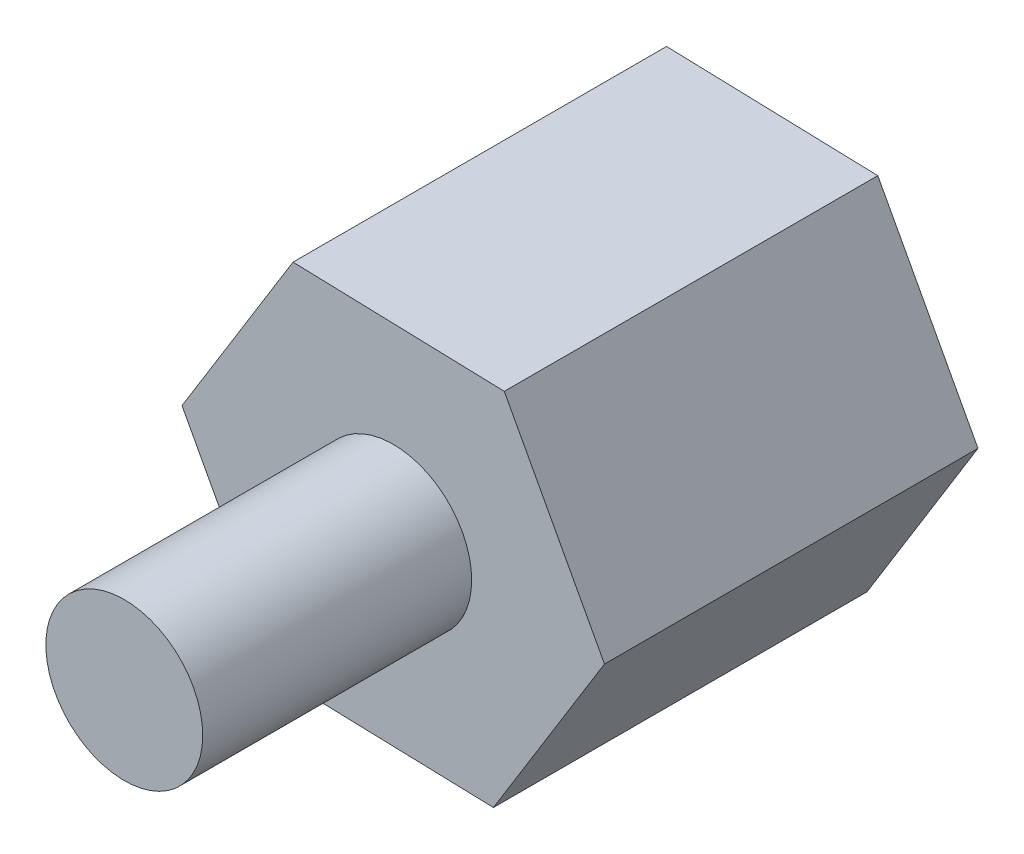
ISO-10303-21;
HEADER;
FILE_DESCRIPTION(('STEP AP214'),'2;1');
FILE_NAME('part.step','',(''),(''),'','','');
FILE_SCHEMA(('AUTOMOTIVE_DESIGN { 1 0 10303 214 1 1 1 1 }'));
ENDSEC;
DATA;
#1=APPLICATION_CONTEXT('core data for automotive mechanical design processes');
#2=APPLICATION_PROTOCOL_DEFINITION('international standard','automotive_design',2000,#1);
#3=PRODUCT_CONTEXT('',#1,'mechanical');
#4=PRODUCT('Part','Part','',(#3));
#5=PRODUCT_RELATED_PRODUCT_CATEGORY('part','',(#4));
#6=PRODUCT_DEFINITION_FORMATION('','',#4);
#7=PRODUCT_DEFINITION_CONTEXT('part definition',#1,'design');
#8=PRODUCT_DEFINITION('design','',#6,#7);
#9=PRODUCT_DEFINITION_SHAPE('','',#8);
#10=(LENGTH_UNIT() NAMED_UNIT(*) SI_UNIT(.MILLI.,.METRE.));
#11=(NAMED_UNIT(*) PLANE_ANGLE_UNIT() SI_UNIT($,.RADIAN.));
#12=(NAMED_UNIT(*) SI_UNIT($,.STERADIAN.) SOLID_ANGLE_UNIT());
#13=UNCERTAINTY_MEASURE_WITH_UNIT(LENGTH_MEASURE(1.E-05),#10,'distance_accuracy_value','');
#14=(GEOMETRIC_REPRESENTATION_CONTEXT(3) GLOBAL_UNCERTAINTY_ASSIGNED_CONTEXT((#13)) GLOBAL_UNIT_ASSIGNED_CONTEXT((#10,
#11,#12)) REPRESENTATION_CONTEXT('',''));
#15=CARTESIAN_POINT('',(0.,0.,0.));
#16=DIRECTION('',(0.,0.,1.));
#17=DIRECTION('',(1.,0.,0.));
#18=AXIS2_PLACEMENT_3D('',#15,#16,#17);
#19=CARTESIAN_POINT('',(1.88801747757183,3.05679020178301,6.35));
#20=DIRECTION('',(0.,0.,1.));
#21=DIRECTION('',(1.,0.,0.));
#22=AXIS2_PLACEMENT_3D('',#19,#20,#21);
#23=PLANE('',#22);
#24=DIRECTION('',(-0.474066238841119,0.880489182892689,0.));
#25=VECTOR('',#24,1.);
#26=CARTESIAN_POINT('',(3.59126670756936,-0.106675997474725,6.35));
#27=LINE('',#26,#25);
#28=CARTESIAN_POINT('',(3.59126670756936,-0.106675997474725,6.35));
#29=VERTEX_POINT('',#28);
#30=CARTESIAN_POINT('',(1.88801747757183,3.05679020178301,6.35));
#31=VERTEX_POINT('',#30);
#32=EDGE_CURVE('E148',#29,#31,#27,.T.);
#33=ORIENTED_EDGE('',*,*,#32,.T.);
#34=DIRECTION('',(-0.999559119563031,0.0296911855333934,0.));
#35=VECTOR('',#34,1.);
#36=CARTESIAN_POINT('',(1.88801747757183,3.05679020178301,6.35));
#37=LINE('',#36,#35);
#38=CARTESIAN_POINT('',(-1.70324922999752,3.16346619925773,6.35));
#39=VERTEX_POINT('',#38);
#40=EDGE_CURVE('E99',#31,#39,#37,.T.);
#41=ORIENTED_EDGE('',*,*,#40,.T.);
#42=DIRECTION('',(-0.525492880721911,-0.850797997359295,0.));
#43=VECTOR('',#42,1.);
#44=CARTESIAN_POINT('',(-1.70324922999752,3.16346619925773,6.35));
#45=LINE('',#44,#43);
#46=CARTESIAN_POINT('',(-3.59126670756936,0.106675997474717,6.35));
#47=VERTEX_POINT('',#46);
#48=EDGE_CURVE('E113',#39,#47,#45,.T.);
#49=ORIENTED_EDGE('',*,*,#48,.T.);
#50=DIRECTION('',(0.474066238841119,-0.880489182892689,0.));
#51=VECTOR('',#50,1.);
#52=CARTESIAN_POINT('',(-3.59126670756936,0.106675997474717,6.35));
#53=LINE('',#52,#51);
#54=CARTESIAN_POINT('',(-1.88801747757183,-3.05679020178301,6.35));
#55=VERTEX_POINT('',#54);
#56=EDGE_CURVE('E107',#47,#55,#53,.T.);
#57=ORIENTED_EDGE('',*,*,#56,.T.);
#58=DIRECTION('',(0.999559119563031,-0.0296911855333934,0.));
#59=VECTOR('',#58,1.);
#60=CARTESIAN_POINT('',(-1.88801747757183,-3.05679020178301,6.35));
#61=LINE('',#60,#59);
#62=CARTESIAN_POINT('',(1.70324922999752,-3.16346619925774,6.35));
#63=VERTEX_POINT('',#62);
#64=EDGE_CURVE('E111',#55,#63,#61,.T.);
#65=ORIENTED_EDGE('',*,*,#64,.T.);
#66=DIRECTION('',(0.525492880721912,0.850797997359295,0.));
#67=VECTOR('',#66,1.);
#68=CARTESIAN_POINT('',(1.70324922999752,-3.16346619925774,6.35));
#69=LINE('',#68,#67);
#70=EDGE_CURVE('E57',#63,#29,#69,.T.);
#71=ORIENTED_EDGE('',*,*,#70,.T.);
#72=EDGE_LOOP('',(#33,#41,#49,#57,#65,#71));
#73=FACE_BOUND('',#72,.T.);
#74=CARTESIAN_POINT('',(0.,0.,6.35));
#75=DIRECTION('',(0.,0.,1.));
#76=DIRECTION('',(1.,0.,0.));
#77=AXIS2_PLACEMENT_3D('',#74,#75,#76);
#78=CIRCLE('',#77,1.3335);
#79=CARTESIAN_POINT('',(1.3335,0.,6.35));
#80=VERTEX_POINT('',#79);
#81=EDGE_CURVE('E204',#80,#80,#78,.T.);
#82=ORIENTED_EDGE('',*,*,#81,.F.);
#83=EDGE_LOOP('',(#82));
#84=FACE_BOUND('',#83,.T.);
#85=ADVANCED_FACE('F38',(#73,#84),#23,.T.);
#86=CARTESIAN_POINT('',(3.59126670756936,-0.106675997474725,6.35));
#87=DIRECTION('',(-0.880489182892689,-0.474066238841119,0.));
#88=DIRECTION('',(0.474066238841119,-0.880489182892689,0.));
#89=AXIS2_PLACEMENT_3D('',#86,#87,#88);
#90=PLANE('',#89);
#91=DIRECTION('',(-0.474066238841119,0.880489182892689,0.));
#92=VECTOR('',#91,1.);
#93=CARTESIAN_POINT('',(3.59126670756936,-0.106675997474725,0.));
#94=LINE('',#93,#92);
#95=CARTESIAN_POINT('',(3.59126670756936,-0.106675997474725,0.));
#96=VERTEX_POINT('',#95);
#97=CARTESIAN_POINT('',(1.88801747757183,3.05679020178301,0.));
#98=VERTEX_POINT('',#97);
#99=EDGE_CURVE('E135',#96,#98,#94,.T.);
#100=ORIENTED_EDGE('',*,*,#99,.T.);
#101=DIRECTION('',(0.,0.,-1.));
#102=VECTOR('',#101,1.);
#103=CARTESIAN_POINT('',(1.88801747757183,3.05679020178301,6.35));
#104=LINE('',#103,#102);
#105=EDGE_CURVE('E11',#31,#98,#104,.T.);
#106=ORIENTED_EDGE('',*,*,#105,.F.);
#107=ORIENTED_EDGE('',*,*,#32,.F.);
#108=DIRECTION('',(0.,0.,-1.));
#109=VECTOR('',#108,1.);
#110=CARTESIAN_POINT('',(3.59126670756936,-0.106675997474725,6.35));
#111=LINE('',#110,#109);
#112=EDGE_CURVE('E131',#29,#96,#111,.T.);
#113=ORIENTED_EDGE('',*,*,#112,.T.);
#114=EDGE_LOOP('',(#100,#106,#107,#113));
#115=FACE_BOUND('',#114,.T.);
#116=ADVANCED_FACE('F40',(#115),#90,.F.);
#117=CARTESIAN_POINT('',(1.88801747757183,3.05679020178301,6.35));
#118=DIRECTION('',(-0.0296911855333934,-0.999559119563031,0.));
#119=DIRECTION('',(0.999559119563031,-0.0296911855333934,0.));
#120=AXIS2_PLACEMENT_3D('',#117,#118,#119);
#121=PLANE('',#120);
#122=DIRECTION('',(-0.999559119563031,0.0296911855333934,0.));
#123=VECTOR('',#122,1.);
#124=CARTESIAN_POINT('',(1.88801747757183,3.05679020178301,0.));
#125=LINE('',#124,#123);
#126=CARTESIAN_POINT('',(-1.70324922999752,3.16346619925773,0.));
#127=VERTEX_POINT('',#126);
#128=EDGE_CURVE('E138',#98,#127,#125,.T.);
#129=ORIENTED_EDGE('',*,*,#128,.T.);
#130=DIRECTION('',(0.,0.,-1.));
#131=VECTOR('',#130,1.);
#132=CARTESIAN_POINT('',(-1.70324922999752,3.16346619925773,6.35));
#133=LINE('',#132,#131);
#134=EDGE_CURVE('E47',#39,#127,#133,.T.);
#135=ORIENTED_EDGE('',*,*,#134,.F.);
#136=ORIENTED_EDGE('',*,*,#40,.F.);
#137=ORIENTED_EDGE('',*,*,#105,.T.);
#138=EDGE_LOOP('',(#129,#135,#136,#137));
#139=FACE_BOUND('',#138,.T.);
#140=ADVANCED_FACE('F183',(#139),#121,.F.);
#141=CARTESIAN_POINT('',(-1.70324922999752,3.16346619925773,6.35));
#142=DIRECTION('',(0.850797997359295,-0.525492880721911,0.));
#143=DIRECTION('',(0.525492880721911,0.850797997359295,0.));
#144=AXIS2_PLACEMENT_3D('',#141,#142,#143);
#145=PLANE('',#144);
#146=DIRECTION('',(-0.525492880721911,-0.850797997359295,0.));
#147=VECTOR('',#146,1.);
#148=CARTESIAN_POINT('',(-1.70324922999752,3.16346619925773,0.));
#149=LINE('',#148,#147);
#150=CARTESIAN_POINT('',(-3.59126670756936,0.106675997474717,0.));
#151=VERTEX_POINT('',#150);
#152=EDGE_CURVE('E141',#127,#151,#149,.T.);
#153=ORIENTED_EDGE('',*,*,#152,.T.);
#154=DIRECTION('',(0.,0.,-1.));
#155=VECTOR('',#154,1.);
#156=CARTESIAN_POINT('',(-3.59126670756936,0.106675997474717,6.35));
#157=LINE('',#156,#155);
#158=EDGE_CURVE('E124',#47,#151,#157,.T.);
#159=ORIENTED_EDGE('',*,*,#158,.F.);
#160=ORIENTED_EDGE('',*,*,#48,.F.);
#161=ORIENTED_EDGE('',*,*,#134,.T.);
#162=EDGE_LOOP('',(#153,#159,#160,#161));
#163=FACE_BOUND('',#162,.T.);
#164=ADVANCED_FACE('F160',(#163),#145,.F.);
#165=CARTESIAN_POINT('',(-3.59126670756936,0.106675997474717,6.35));
#166=DIRECTION('',(0.880489182892689,0.474066238841119,0.));
#167=DIRECTION('',(-0.474066238841119,0.880489182892689,0.));
#168=AXIS2_PLACEMENT_3D('',#165,#166,#167);
#169=PLANE('',#168);
#170=DIRECTION('',(0.474066238841119,-0.880489182892689,0.));
#171=VECTOR('',#170,1.);
#172=CARTESIAN_POINT('',(-3.59126670756936,0.106675997474717,0.));
#173=LINE('',#172,#171);
#174=CARTESIAN_POINT('',(-1.88801747757183,-3.05679020178301,0.));
#175=VERTEX_POINT('',#174);
#176=EDGE_CURVE('E122',#151,#175,#173,.T.);
#177=ORIENTED_EDGE('',*,*,#176,.T.);
#178=DIRECTION('',(0.,0.,-1.));
#179=VECTOR('',#178,1.);
#180=CARTESIAN_POINT('',(-1.88801747757183,-3.05679020178301,6.35));
#181=LINE('',#180,#179);
#182=EDGE_CURVE('E119',#55,#175,#181,.T.);
#183=ORIENTED_EDGE('',*,*,#182,.F.);
#184=ORIENTED_EDGE('',*,*,#56,.F.);
#185=ORIENTED_EDGE('',*,*,#158,.T.);
#186=EDGE_LOOP('',(#177,#183,#184,#185));
#187=FACE_BOUND('',#186,.T.);
#188=ADVANCED_FACE('F120',(#187),#169,.F.);
#189=CARTESIAN_POINT('',(-1.88801747757183,-3.05679020178301,6.35));
#190=DIRECTION('',(0.0296911855333934,0.999559119563031,0.));
#191=DIRECTION('',(-0.999559119563031,0.0296911855333934,0.));
#192=AXIS2_PLACEMENT_3D('',#189,#190,#191);
#193=PLANE('',#192);
#194=DIRECTION('',(0.999559119563031,-0.0296911855333934,0.));
#195=VECTOR('',#194,1.);
#196=CARTESIAN_POINT('',(-1.88801747757183,-3.05679020178301,0.));
#197=LINE('',#196,#195);
#198=CARTESIAN_POINT('',(1.70324922999752,-3.16346619925774,0.));
#199=VERTEX_POINT('',#198);
#200=EDGE_CURVE('E85',#175,#199,#197,.T.);
#201=ORIENTED_EDGE('',*,*,#200,.T.);
#202=DIRECTION('',(0.,0.,-1.));
#203=VECTOR('',#202,1.);
#204=CARTESIAN_POINT('',(1.70324922999752,-3.16346619925774,6.35));
#205=LINE('',#204,#203);
#206=EDGE_CURVE('E125',#63,#199,#205,.T.);
#207=ORIENTED_EDGE('',*,*,#206,.F.);
#208=ORIENTED_EDGE('',*,*,#64,.F.);
#209=ORIENTED_EDGE('',*,*,#182,.T.);
#210=EDGE_LOOP('',(#201,#207,#208,#209));
#211=FACE_BOUND('',#210,.T.);
#212=ADVANCED_FACE('F127',(#211),#193,.F.);
#213=CARTESIAN_POINT('',(1.70324922999752,-3.16346619925774,6.35));
#214=DIRECTION('',(-0.850797997359295,0.525492880721912,0.));
#215=DIRECTION('',(-0.525492880721912,-0.850797997359295,0.));
#216=AXIS2_PLACEMENT_3D('',#213,#214,#215);
#217=PLANE('',#216);
#218=DIRECTION('',(0.525492880721912,0.850797997359295,0.));
#219=VECTOR('',#218,1.);
#220=CARTESIAN_POINT('',(1.70324922999752,-3.16346619925774,0.));
#221=LINE('',#220,#219);
#222=EDGE_CURVE('E91',#199,#96,#221,.T.);
#223=ORIENTED_EDGE('',*,*,#222,.T.);
#224=ORIENTED_EDGE('',*,*,#112,.F.);
#225=ORIENTED_EDGE('',*,*,#70,.F.);
#226=ORIENTED_EDGE('',*,*,#206,.T.);
#227=EDGE_LOOP('',(#223,#224,#225,#226));
#228=FACE_BOUND('',#227,.T.);
#229=ADVANCED_FACE('F167',(#228),#217,.F.);
#230=CARTESIAN_POINT('',(1.88801747757183,3.05679020178301,0.));
#231=DIRECTION('',(0.,0.,1.));
#232=DIRECTION('',(1.,0.,0.));
#233=AXIS2_PLACEMENT_3D('',#230,#231,#232);
#234=PLANE('',#233);
#235=CARTESIAN_POINT('',(0.,0.,0.));
#236=DIRECTION('',(0.,0.,-1.));
#237=DIRECTION('',(-1.,0.,0.));
#238=AXIS2_PLACEMENT_3D('',#235,#236,#237);
#239=CIRCLE('',#238,1.3335);
#240=CARTESIAN_POINT('',(-1.3335,0.,0.));
#241=VERTEX_POINT('',#240);
#242=EDGE_CURVE('E205',#241,#241,#239,.T.);
#243=ORIENTED_EDGE('',*,*,#242,.F.);
#244=EDGE_LOOP('',(#243));
#245=FACE_BOUND('',#244,.T.);
#246=ORIENTED_EDGE('',*,*,#99,.F.);
#247=ORIENTED_EDGE('',*,*,#222,.F.);
#248=ORIENTED_EDGE('',*,*,#200,.F.);
#249=ORIENTED_EDGE('',*,*,#176,.F.);
#250=ORIENTED_EDGE('',*,*,#152,.F.);
#251=ORIENTED_EDGE('',*,*,#128,.F.);
#252=EDGE_LOOP('',(#246,#247,#248,#249,#250,#251));
#253=FACE_BOUND('',#252,.T.);
#254=ADVANCED_FACE('F163',(#245,#253),#234,.F.);
#255=CARTESIAN_POINT('',(0.,0.,10.922));
#256=DIRECTION('',(0.,0.,-1.));
#257=DIRECTION('',(-1.,0.,0.));
#258=AXIS2_PLACEMENT_3D('',#255,#256,#257);
#259=CYLINDRICAL_SURFACE('',#258,1.3335);
#260=CARTESIAN_POINT('',(0.,0.,10.922));
#261=DIRECTION('',(0.,0.,1.));
#262=DIRECTION('',(1.,0.,0.));
#263=AXIS2_PLACEMENT_3D('',#260,#261,#262);
#264=CIRCLE('',#263,1.3335);
#265=CARTESIAN_POINT('',(1.3335,0.,10.922));
#266=VERTEX_POINT('',#265);
#267=EDGE_CURVE('E139',#266,#266,#264,.T.);
#268=ORIENTED_EDGE('',*,*,#267,.F.);
#269=EDGE_LOOP('',(#268));
#270=FACE_BOUND('',#269,.T.);
#271=ORIENTED_EDGE('',*,*,#81,.T.);
#272=EDGE_LOOP('',(#271));
#273=FACE_BOUND('',#272,.T.);
#274=ADVANCED_FACE('F174',(#270,#273),#259,.T.);
#275=CARTESIAN_POINT('',(0.,0.,10.922));
#276=DIRECTION('',(0.,0.,1.));
#277=DIRECTION('',(1.,0.,0.));
#278=AXIS2_PLACEMENT_3D('',#275,#276,#277);
#279=PLANE('',#278);
#280=ORIENTED_EDGE('',*,*,#267,.T.);
#281=EDGE_LOOP('',(#280));
#282=FACE_BOUND('',#281,.T.);
#283=ADVANCED_FACE('F187',(#282),#279,.T.);
#284=CARTESIAN_POINT('',(0.,0.,5.08));
#285=DIRECTION('',(0.,0.,-1.));
#286=DIRECTION('',(-1.,0.,0.));
#287=AXIS2_PLACEMENT_3D('',#284,#285,#286);
#288=CYLINDRICAL_SURFACE('',#287,1.3335);
#289=CARTESIAN_POINT('',(0.,0.,5.08));
#290=DIRECTION('',(0.,0.,-1.));
#291=DIRECTION('',(-1.,0.,0.));
#292=AXIS2_PLACEMENT_3D('',#289,#290,#291);
#293=CIRCLE('',#292,1.3335);
#294=CARTESIAN_POINT('',(-1.3335,0.,5.08));
#295=VERTEX_POINT('',#294);
#296=EDGE_CURVE('E203',#295,#295,#293,.T.);
#297=ORIENTED_EDGE('',*,*,#296,.F.);
#298=EDGE_LOOP('',(#297));
#299=FACE_BOUND('',#298,.T.);
#300=ORIENTED_EDGE('',*,*,#242,.T.);
#301=EDGE_LOOP('',(#300));
#302=FACE_BOUND('',#301,.T.);
#303=ADVANCED_FACE('F191',(#299,#302),#288,.F.);
#304=CARTESIAN_POINT('',(0.,0.,5.08));
#305=DIRECTION('',(0.,0.,-1.));
#306=DIRECTION('',(-1.,0.,0.));
#307=AXIS2_PLACEMENT_3D('',#304,#305,#306);
#308=PLANE('',#307);
#309=ORIENTED_EDGE('',*,*,#296,.T.);
#310=EDGE_LOOP('',(#309));
#311=FACE_BOUND('',#310,.T.);
#312=ADVANCED_FACE('F195',(#311),#308,.T.);
#313=CLOSED_SHELL('',(#85,#116,#140,#164,#188,#212,#229,#254,#274,#283,#303,#312));
#314=MANIFOLD_SOLID_BREP('B2',#313);
#315=ADVANCED_BREP_SHAPE_REPRESENTATION('',(#18,#314),#14);
#316=SHAPE_DEFINITION_REPRESENTATION(#9,#315);
ENDSEC;
END-ISO-10303-21;
